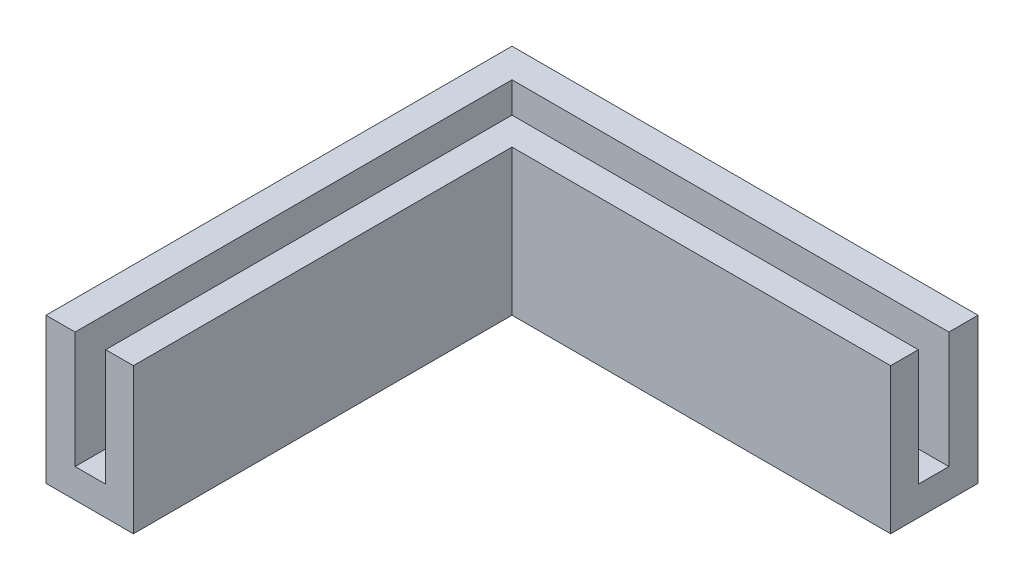
ISO-10303-21;
HEADER;
FILE_DESCRIPTION(('STEP AP214'),'2;1');
FILE_NAME('part.step','',(''),(''),'','','');
FILE_SCHEMA(('AUTOMOTIVE_DESIGN { 1 0 10303 214 1 1 1 1 }'));
ENDSEC;
DATA;
#1=APPLICATION_CONTEXT('core data for automotive mechanical design processes');
#2=APPLICATION_PROTOCOL_DEFINITION('international standard','automotive_design',2000,#1);
#3=PRODUCT_CONTEXT('',#1,'mechanical');
#4=PRODUCT('Part','Part','',(#3));
#5=PRODUCT_RELATED_PRODUCT_CATEGORY('part','',(#4));
#6=PRODUCT_DEFINITION_FORMATION('','',#4);
#7=PRODUCT_DEFINITION_CONTEXT('part definition',#1,'design');
#8=PRODUCT_DEFINITION('design','',#6,#7);
#9=PRODUCT_DEFINITION_SHAPE('','',#8);
#10=(LENGTH_UNIT() NAMED_UNIT(*) SI_UNIT(.MILLI.,.METRE.));
#11=(NAMED_UNIT(*) PLANE_ANGLE_UNIT() SI_UNIT($,.RADIAN.));
#12=(NAMED_UNIT(*) SI_UNIT($,.STERADIAN.) SOLID_ANGLE_UNIT());
#13=UNCERTAINTY_MEASURE_WITH_UNIT(LENGTH_MEASURE(1.E-05),#10,'distance_accuracy_value','');
#14=(GEOMETRIC_REPRESENTATION_CONTEXT(3) GLOBAL_UNCERTAINTY_ASSIGNED_CONTEXT((#13)) GLOBAL_UNIT_ASSIGNED_CONTEXT((#10,
#11,#12)) REPRESENTATION_CONTEXT('',''));
#15=CARTESIAN_POINT('',(0.,0.,0.));
#16=DIRECTION('',(0.,0.,1.));
#17=DIRECTION('',(1.,0.,0.));
#18=AXIS2_PLACEMENT_3D('',#15,#16,#17);
#19=CARTESIAN_POINT('',(0.,2.,0.));
#20=DIRECTION('',(0.,-1.,0.));
#21=DIRECTION('',(0.,0.,-1.));
#22=AXIS2_PLACEMENT_3D('',#19,#20,#21);
#23=PLANE('',#22);
#24=DIRECTION('',(-1.,0.,0.));
#25=VECTOR('',#24,1.);
#26=CARTESIAN_POINT('',(32.,2.,4.1));
#27=LINE('',#26,#25);
#28=CARTESIAN_POINT('',(32.,2.,4.1));
#29=VERTEX_POINT('',#28);
#30=CARTESIAN_POINT('',(4.1,2.,4.1));
#31=VERTEX_POINT('',#30);
#32=EDGE_CURVE('E146',#29,#31,#27,.T.);
#33=ORIENTED_EDGE('',*,*,#32,.F.);
#34=DIRECTION('',(0.,0.,-1.));
#35=VECTOR('',#34,1.);
#36=CARTESIAN_POINT('',(32.,2.,0.));
#37=LINE('',#36,#35);
#38=CARTESIAN_POINT('',(32.,2.,2.));
#39=VERTEX_POINT('',#38);
#40=EDGE_CURVE('E134',#29,#39,#37,.T.);
#41=ORIENTED_EDGE('',*,*,#40,.T.);
#42=DIRECTION('',(1.,0.,0.));
#43=VECTOR('',#42,1.);
#44=CARTESIAN_POINT('',(2.,2.,2.));
#45=LINE('',#44,#43);
#46=CARTESIAN_POINT('',(2.,2.,2.));
#47=VERTEX_POINT('',#46);
#48=EDGE_CURVE('E193',#47,#39,#45,.T.);
#49=ORIENTED_EDGE('',*,*,#48,.F.);
#50=DIRECTION('',(0.,0.,-1.));
#51=VECTOR('',#50,1.);
#52=CARTESIAN_POINT('',(2.,2.,32.));
#53=LINE('',#52,#51);
#54=CARTESIAN_POINT('',(2.,2.,32.));
#55=VERTEX_POINT('',#54);
#56=EDGE_CURVE('E151',#55,#47,#53,.T.);
#57=ORIENTED_EDGE('',*,*,#56,.F.);
#58=DIRECTION('',(1.,0.,0.));
#59=VECTOR('',#58,1.);
#60=CARTESIAN_POINT('',(6.,2.,32.));
#61=LINE('',#60,#59);
#62=CARTESIAN_POINT('',(4.1,2.,32.));
#63=VERTEX_POINT('',#62);
#64=EDGE_CURVE('E66',#55,#63,#61,.T.);
#65=ORIENTED_EDGE('',*,*,#64,.T.);
#66=DIRECTION('',(0.,0.,1.));
#67=VECTOR('',#66,1.);
#68=CARTESIAN_POINT('',(4.1,2.,4.1));
#69=LINE('',#68,#67);
#70=EDGE_CURVE('E61',#31,#63,#69,.T.);
#71=ORIENTED_EDGE('',*,*,#70,.F.);
#72=EDGE_LOOP('',(#33,#41,#49,#57,#65,#71));
#73=FACE_BOUND('',#72,.T.);
#74=ADVANCED_FACE('F45',(#73),#23,.F.);
#75=CARTESIAN_POINT('',(0.,2.,32.));
#76=DIRECTION('',(1.,0.,0.));
#77=DIRECTION('',(0.,0.,-1.));
#78=AXIS2_PLACEMENT_3D('',#75,#76,#77);
#79=PLANE('',#78);
#80=DIRECTION('',(0.,0.,1.));
#81=VECTOR('',#80,1.);
#82=CARTESIAN_POINT('',(0.,0.,32.));
#83=LINE('',#82,#81);
#84=CARTESIAN_POINT('',(0.,0.,0.));
#85=VERTEX_POINT('',#84);
#86=CARTESIAN_POINT('',(0.,0.,32.));
#87=VERTEX_POINT('',#86);
#88=EDGE_CURVE('E226',#85,#87,#83,.T.);
#89=ORIENTED_EDGE('',*,*,#88,.T.);
#90=DIRECTION('',(0.,-1.,0.));
#91=VECTOR('',#90,1.);
#92=CARTESIAN_POINT('',(0.,2.,32.));
#93=LINE('',#92,#91);
#94=CARTESIAN_POINT('',(0.,10.,32.));
#95=VERTEX_POINT('',#94);
#96=EDGE_CURVE('E11',#95,#87,#93,.T.);
#97=ORIENTED_EDGE('',*,*,#96,.F.);
#98=DIRECTION('',(0.,0.,1.));
#99=VECTOR('',#98,1.);
#100=CARTESIAN_POINT('',(0.,10.,32.));
#101=LINE('',#100,#99);
#102=CARTESIAN_POINT('',(0.,10.,0.));
#103=VERTEX_POINT('',#102);
#104=EDGE_CURVE('E207',#103,#95,#101,.T.);
#105=ORIENTED_EDGE('',*,*,#104,.F.);
#106=DIRECTION('',(0.,-1.,0.));
#107=VECTOR('',#106,1.);
#108=CARTESIAN_POINT('',(0.,2.,0.));
#109=LINE('',#108,#107);
#110=EDGE_CURVE('E144',#103,#85,#109,.T.);
#111=ORIENTED_EDGE('',*,*,#110,.T.);
#112=EDGE_LOOP('',(#89,#97,#105,#111));
#113=FACE_BOUND('',#112,.T.);
#114=ADVANCED_FACE('F47',(#113),#79,.F.);
#115=CARTESIAN_POINT('',(6.,2.,32.));
#116=DIRECTION('',(0.,0.,-1.));
#117=DIRECTION('',(-1.,0.,0.));
#118=AXIS2_PLACEMENT_3D('',#115,#116,#117);
#119=PLANE('',#118);
#120=DIRECTION('',(1.,0.,0.));
#121=VECTOR('',#120,1.);
#122=CARTESIAN_POINT('',(6.,0.,32.));
#123=LINE('',#122,#121);
#124=CARTESIAN_POINT('',(6.,0.,32.));
#125=VERTEX_POINT('',#124);
#126=EDGE_CURVE('E233',#87,#125,#123,.T.);
#127=ORIENTED_EDGE('',*,*,#126,.T.);
#128=DIRECTION('',(0.,-1.,0.));
#129=VECTOR('',#128,1.);
#130=CARTESIAN_POINT('',(6.,2.,32.));
#131=LINE('',#130,#129);
#132=CARTESIAN_POINT('',(6.,10.,32.));
#133=VERTEX_POINT('',#132);
#134=EDGE_CURVE('E54',#133,#125,#131,.T.);
#135=ORIENTED_EDGE('',*,*,#134,.F.);
#136=DIRECTION('',(1.,0.,0.));
#137=VECTOR('',#136,1.);
#138=CARTESIAN_POINT('',(6.,10.,32.));
#139=LINE('',#138,#137);
#140=CARTESIAN_POINT('',(4.1,10.,32.));
#141=VERTEX_POINT('',#140);
#142=EDGE_CURVE('E177',#141,#133,#139,.T.);
#143=ORIENTED_EDGE('',*,*,#142,.F.);
#144=DIRECTION('',(0.,-1.,0.));
#145=VECTOR('',#144,1.);
#146=CARTESIAN_POINT('',(4.1,10.,32.));
#147=LINE('',#146,#145);
#148=EDGE_CURVE('E160',#141,#63,#147,.T.);
#149=ORIENTED_EDGE('',*,*,#148,.T.);
#150=ORIENTED_EDGE('',*,*,#64,.F.);
#151=DIRECTION('',(0.,-1.,0.));
#152=VECTOR('',#151,1.);
#153=CARTESIAN_POINT('',(2.,10.,32.));
#154=LINE('',#153,#152);
#155=CARTESIAN_POINT('',(2.,10.,32.));
#156=VERTEX_POINT('',#155);
#157=EDGE_CURVE('E222',#156,#55,#154,.T.);
#158=ORIENTED_EDGE('',*,*,#157,.F.);
#159=DIRECTION('',(1.,0.,0.));
#160=VECTOR('',#159,1.);
#161=CARTESIAN_POINT('',(2.,10.,32.));
#162=LINE('',#161,#160);
#163=EDGE_CURVE('E188',#95,#156,#162,.T.);
#164=ORIENTED_EDGE('',*,*,#163,.F.);
#165=ORIENTED_EDGE('',*,*,#96,.T.);
#166=EDGE_LOOP('',(#127,#135,#143,#149,#150,#158,#164,#165));
#167=FACE_BOUND('',#166,.T.);
#168=ADVANCED_FACE('F282',(#167),#119,.F.);
#169=CARTESIAN_POINT('',(6.,2.,6.));
#170=DIRECTION('',(-1.,0.,0.));
#171=DIRECTION('',(0.,0.,1.));
#172=AXIS2_PLACEMENT_3D('',#169,#170,#171);
#173=PLANE('',#172);
#174=DIRECTION('',(0.,0.,-1.));
#175=VECTOR('',#174,1.);
#176=CARTESIAN_POINT('',(6.,0.,6.));
#177=LINE('',#176,#175);
#178=CARTESIAN_POINT('',(6.,0.,6.));
#179=VERTEX_POINT('',#178);
#180=EDGE_CURVE('E236',#125,#179,#177,.T.);
#181=ORIENTED_EDGE('',*,*,#180,.T.);
#182=DIRECTION('',(0.,-1.,0.));
#183=VECTOR('',#182,1.);
#184=CARTESIAN_POINT('',(6.,2.,6.));
#185=LINE('',#184,#183);
#186=CARTESIAN_POINT('',(6.,10.,6.));
#187=VERTEX_POINT('',#186);
#188=EDGE_CURVE('E258',#187,#179,#185,.T.);
#189=ORIENTED_EDGE('',*,*,#188,.F.);
#190=DIRECTION('',(0.,0.,-1.));
#191=VECTOR('',#190,1.);
#192=CARTESIAN_POINT('',(6.,10.,6.));
#193=LINE('',#192,#191);
#194=EDGE_CURVE('E173',#133,#187,#193,.T.);
#195=ORIENTED_EDGE('',*,*,#194,.F.);
#196=ORIENTED_EDGE('',*,*,#134,.T.);
#197=EDGE_LOOP('',(#181,#189,#195,#196));
#198=FACE_BOUND('',#197,.T.);
#199=ADVANCED_FACE('F266',(#198),#173,.F.);
#200=CARTESIAN_POINT('',(32.,2.,6.));
#201=DIRECTION('',(0.,0.,-1.));
#202=DIRECTION('',(-1.,0.,0.));
#203=AXIS2_PLACEMENT_3D('',#200,#201,#202);
#204=PLANE('',#203);
#205=DIRECTION('',(1.,0.,0.));
#206=VECTOR('',#205,1.);
#207=CARTESIAN_POINT('',(32.,0.,6.));
#208=LINE('',#207,#206);
#209=CARTESIAN_POINT('',(32.,0.,6.));
#210=VERTEX_POINT('',#209);
#211=EDGE_CURVE('E239',#179,#210,#208,.T.);
#212=ORIENTED_EDGE('',*,*,#211,.T.);
#213=DIRECTION('',(0.,-1.,0.));
#214=VECTOR('',#213,1.);
#215=CARTESIAN_POINT('',(32.,2.,6.));
#216=LINE('',#215,#214);
#217=CARTESIAN_POINT('',(32.,10.,6.));
#218=VERTEX_POINT('',#217);
#219=EDGE_CURVE('E254',#218,#210,#216,.T.);
#220=ORIENTED_EDGE('',*,*,#219,.F.);
#221=DIRECTION('',(1.,0.,0.));
#222=VECTOR('',#221,1.);
#223=CARTESIAN_POINT('',(32.,10.,6.));
#224=LINE('',#223,#222);
#225=EDGE_CURVE('E166',#187,#218,#224,.T.);
#226=ORIENTED_EDGE('',*,*,#225,.F.);
#227=ORIENTED_EDGE('',*,*,#188,.T.);
#228=EDGE_LOOP('',(#212,#220,#226,#227));
#229=FACE_BOUND('',#228,.T.);
#230=ADVANCED_FACE('F276',(#229),#204,.F.);
#231=CARTESIAN_POINT('',(32.,2.,0.));
#232=DIRECTION('',(-1.,0.,0.));
#233=DIRECTION('',(0.,0.,1.));
#234=AXIS2_PLACEMENT_3D('',#231,#232,#233);
#235=PLANE('',#234);
#236=DIRECTION('',(0.,0.,-1.));
#237=VECTOR('',#236,1.);
#238=CARTESIAN_POINT('',(32.,0.,0.));
#239=LINE('',#238,#237);
#240=CARTESIAN_POINT('',(32.,0.,0.));
#241=VERTEX_POINT('',#240);
#242=EDGE_CURVE('E242',#210,#241,#239,.T.);
#243=ORIENTED_EDGE('',*,*,#242,.T.);
#244=DIRECTION('',(0.,-1.,0.));
#245=VECTOR('',#244,1.);
#246=CARTESIAN_POINT('',(32.,2.,0.));
#247=LINE('',#246,#245);
#248=CARTESIAN_POINT('',(32.,10.,0.));
#249=VERTEX_POINT('',#248);
#250=EDGE_CURVE('E250',#249,#241,#247,.T.);
#251=ORIENTED_EDGE('',*,*,#250,.F.);
#252=DIRECTION('',(0.,0.,-1.));
#253=VECTOR('',#252,1.);
#254=CARTESIAN_POINT('',(32.,10.,0.));
#255=LINE('',#254,#253);
#256=CARTESIAN_POINT('',(32.,10.,2.));
#257=VERTEX_POINT('',#256);
#258=EDGE_CURVE('E199',#257,#249,#255,.T.);
#259=ORIENTED_EDGE('',*,*,#258,.F.);
#260=DIRECTION('',(0.,-1.,0.));
#261=VECTOR('',#260,1.);
#262=CARTESIAN_POINT('',(32.,10.,2.));
#263=LINE('',#262,#261);
#264=EDGE_CURVE('E141',#257,#39,#263,.T.);
#265=ORIENTED_EDGE('',*,*,#264,.T.);
#266=ORIENTED_EDGE('',*,*,#40,.F.);
#267=DIRECTION('',(0.,-1.,0.));
#268=VECTOR('',#267,1.);
#269=CARTESIAN_POINT('',(32.,10.,4.1));
#270=LINE('',#269,#268);
#271=CARTESIAN_POINT('',(32.,10.,4.1));
#272=VERTEX_POINT('',#271);
#273=EDGE_CURVE('E138',#272,#29,#270,.T.);
#274=ORIENTED_EDGE('',*,*,#273,.F.);
#275=DIRECTION('',(0.,0.,-1.));
#276=VECTOR('',#275,1.);
#277=CARTESIAN_POINT('',(32.,10.,4.1));
#278=LINE('',#277,#276);
#279=EDGE_CURVE('E168',#218,#272,#278,.T.);
#280=ORIENTED_EDGE('',*,*,#279,.F.);
#281=ORIENTED_EDGE('',*,*,#219,.T.);
#282=EDGE_LOOP('',(#243,#251,#259,#265,#266,#274,#280,#281));
#283=FACE_BOUND('',#282,.T.);
#284=ADVANCED_FACE('F135',(#283),#235,.F.);
#285=CARTESIAN_POINT('',(0.,2.,0.));
#286=DIRECTION('',(0.,0.,1.));
#287=DIRECTION('',(1.,0.,0.));
#288=AXIS2_PLACEMENT_3D('',#285,#286,#287);
#289=PLANE('',#288);
#290=DIRECTION('',(-1.,0.,0.));
#291=VECTOR('',#290,1.);
#292=CARTESIAN_POINT('',(0.,0.,0.));
#293=LINE('',#292,#291);
#294=EDGE_CURVE('E228',#241,#85,#293,.T.);
#295=ORIENTED_EDGE('',*,*,#294,.T.);
#296=ORIENTED_EDGE('',*,*,#110,.F.);
#297=DIRECTION('',(-1.,0.,0.));
#298=VECTOR('',#297,1.);
#299=CARTESIAN_POINT('',(0.,10.,0.));
#300=LINE('',#299,#298);
#301=EDGE_CURVE('E203',#249,#103,#300,.T.);
#302=ORIENTED_EDGE('',*,*,#301,.F.);
#303=ORIENTED_EDGE('',*,*,#250,.T.);
#304=EDGE_LOOP('',(#295,#296,#302,#303));
#305=FACE_BOUND('',#304,.T.);
#306=ADVANCED_FACE('F307',(#305),#289,.F.);
#307=CARTESIAN_POINT('',(0.,0.,0.));
#308=DIRECTION('',(0.,-1.,0.));
#309=DIRECTION('',(0.,0.,-1.));
#310=AXIS2_PLACEMENT_3D('',#307,#308,#309);
#311=PLANE('',#310);
#312=ORIENTED_EDGE('',*,*,#88,.F.);
#313=ORIENTED_EDGE('',*,*,#294,.F.);
#314=ORIENTED_EDGE('',*,*,#242,.F.);
#315=ORIENTED_EDGE('',*,*,#211,.F.);
#316=ORIENTED_EDGE('',*,*,#180,.F.);
#317=ORIENTED_EDGE('',*,*,#126,.F.);
#318=EDGE_LOOP('',(#312,#313,#314,#315,#316,#317));
#319=FACE_BOUND('',#318,.T.);
#320=ADVANCED_FACE('F272',(#319),#311,.T.);
#321=CARTESIAN_POINT('',(2.,10.,32.));
#322=DIRECTION('',(-1.,0.,0.));
#323=DIRECTION('',(0.,0.,1.));
#324=AXIS2_PLACEMENT_3D('',#321,#322,#323);
#325=PLANE('',#324);
#326=ORIENTED_EDGE('',*,*,#56,.T.);
#327=DIRECTION('',(0.,-1.,0.));
#328=VECTOR('',#327,1.);
#329=CARTESIAN_POINT('',(2.,10.,2.));
#330=LINE('',#329,#328);
#331=CARTESIAN_POINT('',(2.,10.,2.));
#332=VERTEX_POINT('',#331);
#333=EDGE_CURVE('E218',#332,#47,#330,.T.);
#334=ORIENTED_EDGE('',*,*,#333,.F.);
#335=DIRECTION('',(0.,0.,-1.));
#336=VECTOR('',#335,1.);
#337=CARTESIAN_POINT('',(2.,10.,32.));
#338=LINE('',#337,#336);
#339=EDGE_CURVE('E192',#156,#332,#338,.T.);
#340=ORIENTED_EDGE('',*,*,#339,.F.);
#341=ORIENTED_EDGE('',*,*,#157,.T.);
#342=EDGE_LOOP('',(#326,#334,#340,#341));
#343=FACE_BOUND('',#342,.T.);
#344=ADVANCED_FACE('F304',(#343),#325,.F.);
#345=CARTESIAN_POINT('',(2.,10.,2.));
#346=DIRECTION('',(0.,0.,-1.));
#347=DIRECTION('',(-1.,0.,0.));
#348=AXIS2_PLACEMENT_3D('',#345,#346,#347);
#349=PLANE('',#348);
#350=ORIENTED_EDGE('',*,*,#48,.T.);
#351=ORIENTED_EDGE('',*,*,#264,.F.);
#352=DIRECTION('',(1.,0.,0.));
#353=VECTOR('',#352,1.);
#354=CARTESIAN_POINT('',(2.,10.,2.));
#355=LINE('',#354,#353);
#356=EDGE_CURVE('E196',#332,#257,#355,.T.);
#357=ORIENTED_EDGE('',*,*,#356,.F.);
#358=ORIENTED_EDGE('',*,*,#333,.T.);
#359=EDGE_LOOP('',(#350,#351,#357,#358));
#360=FACE_BOUND('',#359,.T.);
#361=ADVANCED_FACE('F348',(#360),#349,.F.);
#362=CARTESIAN_POINT('',(0.,10.,0.));
#363=DIRECTION('',(0.,-1.,0.));
#364=DIRECTION('',(0.,0.,-1.));
#365=AXIS2_PLACEMENT_3D('',#362,#363,#364);
#366=PLANE('',#365);
#367=ORIENTED_EDGE('',*,*,#163,.T.);
#368=ORIENTED_EDGE('',*,*,#339,.T.);
#369=ORIENTED_EDGE('',*,*,#356,.T.);
#370=ORIENTED_EDGE('',*,*,#258,.T.);
#371=ORIENTED_EDGE('',*,*,#301,.T.);
#372=ORIENTED_EDGE('',*,*,#104,.T.);
#373=EDGE_LOOP('',(#367,#368,#369,#370,#371,#372));
#374=FACE_BOUND('',#373,.T.);
#375=ADVANCED_FACE('F293',(#374),#366,.F.);
#376=CARTESIAN_POINT('',(32.,10.,4.1));
#377=DIRECTION('',(0.,0.,1.));
#378=DIRECTION('',(1.,0.,0.));
#379=AXIS2_PLACEMENT_3D('',#376,#377,#378);
#380=PLANE('',#379);
#381=ORIENTED_EDGE('',*,*,#32,.T.);
#382=DIRECTION('',(0.,-1.,0.));
#383=VECTOR('',#382,1.);
#384=CARTESIAN_POINT('',(4.1,10.,4.1));
#385=LINE('',#384,#383);
#386=CARTESIAN_POINT('',(4.1,10.,4.1));
#387=VERTEX_POINT('',#386);
#388=EDGE_CURVE('E157',#387,#31,#385,.T.);
#389=ORIENTED_EDGE('',*,*,#388,.F.);
#390=DIRECTION('',(-1.,0.,0.));
#391=VECTOR('',#390,1.);
#392=CARTESIAN_POINT('',(32.,10.,4.1));
#393=LINE('',#392,#391);
#394=EDGE_CURVE('E154',#272,#387,#393,.T.);
#395=ORIENTED_EDGE('',*,*,#394,.F.);
#396=ORIENTED_EDGE('',*,*,#273,.T.);
#397=EDGE_LOOP('',(#381,#389,#395,#396));
#398=FACE_BOUND('',#397,.T.);
#399=ADVANCED_FACE('F153',(#398),#380,.F.);
#400=CARTESIAN_POINT('',(4.1,10.,4.1));
#401=DIRECTION('',(1.,0.,0.));
#402=DIRECTION('',(0.,0.,-1.));
#403=AXIS2_PLACEMENT_3D('',#400,#401,#402);
#404=PLANE('',#403);
#405=ORIENTED_EDGE('',*,*,#70,.T.);
#406=ORIENTED_EDGE('',*,*,#148,.F.);
#407=DIRECTION('',(0.,0.,1.));
#408=VECTOR('',#407,1.);
#409=CARTESIAN_POINT('',(4.1,10.,4.1));
#410=LINE('',#409,#408);
#411=EDGE_CURVE('E181',#387,#141,#410,.T.);
#412=ORIENTED_EDGE('',*,*,#411,.F.);
#413=ORIENTED_EDGE('',*,*,#388,.T.);
#414=EDGE_LOOP('',(#405,#406,#412,#413));
#415=FACE_BOUND('',#414,.T.);
#416=ADVANCED_FACE('F285',(#415),#404,.F.);
#417=CARTESIAN_POINT('',(0.,10.,0.));
#418=DIRECTION('',(0.,-1.,0.));
#419=DIRECTION('',(0.,0.,-1.));
#420=AXIS2_PLACEMENT_3D('',#417,#418,#419);
#421=PLANE('',#420);
#422=ORIENTED_EDGE('',*,*,#279,.T.);
#423=ORIENTED_EDGE('',*,*,#394,.T.);
#424=ORIENTED_EDGE('',*,*,#411,.T.);
#425=ORIENTED_EDGE('',*,*,#142,.T.);
#426=ORIENTED_EDGE('',*,*,#194,.T.);
#427=ORIENTED_EDGE('',*,*,#225,.T.);
#428=EDGE_LOOP('',(#422,#423,#424,#425,#426,#427));
#429=FACE_BOUND('',#428,.T.);
#430=ADVANCED_FACE('F279',(#429),#421,.F.);
#431=CLOSED_SHELL('',(#74,#114,#168,#199,#230,#284,#306,#320,#344,#361,#375,#399,#416,#430));
#432=MANIFOLD_SOLID_BREP('B2',#431);
#433=ADVANCED_BREP_SHAPE_REPRESENTATION('',(#18,#432),#14);
#434=SHAPE_DEFINITION_REPRESENTATION(#9,#433);
ENDSEC;
END-ISO-10303-21;
